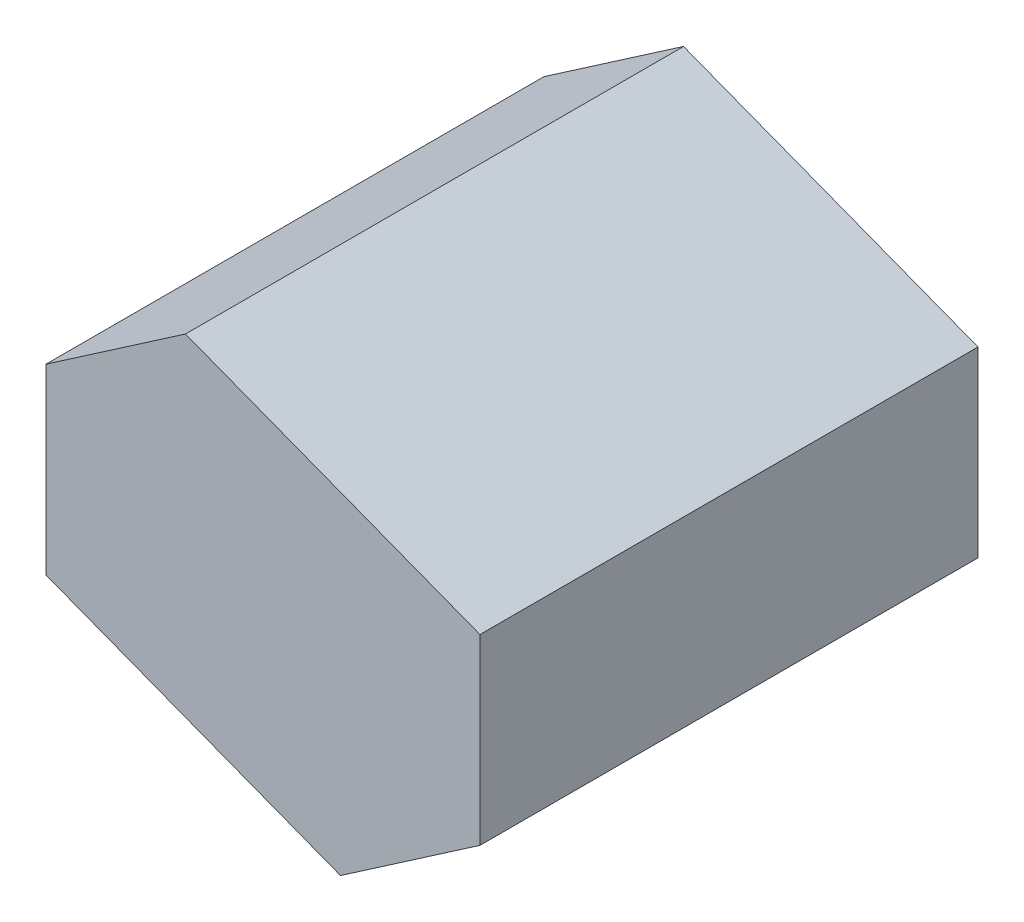
ISO-10303-21;
HEADER;
FILE_DESCRIPTION(('STEP AP214'),'2;1');
FILE_NAME('part.step','',(''),(''),'','','');
FILE_SCHEMA(('AUTOMOTIVE_DESIGN { 1 0 10303 214 1 1 1 1 }'));
ENDSEC;
DATA;
#1=APPLICATION_CONTEXT('core data for automotive mechanical design processes');
#2=APPLICATION_PROTOCOL_DEFINITION('international standard','automotive_design',2000,#1);
#3=PRODUCT_CONTEXT('',#1,'mechanical');
#4=PRODUCT('Part','Part','',(#3));
#5=PRODUCT_RELATED_PRODUCT_CATEGORY('part','',(#4));
#6=PRODUCT_DEFINITION_FORMATION('','',#4);
#7=PRODUCT_DEFINITION_CONTEXT('part definition',#1,'design');
#8=PRODUCT_DEFINITION('design','',#6,#7);
#9=PRODUCT_DEFINITION_SHAPE('','',#8);
#10=(LENGTH_UNIT() NAMED_UNIT(*) SI_UNIT(.MILLI.,.METRE.));
#11=(NAMED_UNIT(*) PLANE_ANGLE_UNIT() SI_UNIT($,.RADIAN.));
#12=(NAMED_UNIT(*) SI_UNIT($,.STERADIAN.) SOLID_ANGLE_UNIT());
#13=UNCERTAINTY_MEASURE_WITH_UNIT(LENGTH_MEASURE(1.E-05),#10,'distance_accuracy_value','');
#14=(GEOMETRIC_REPRESENTATION_CONTEXT(3) GLOBAL_UNCERTAINTY_ASSIGNED_CONTEXT((#13)) GLOBAL_UNIT_ASSIGNED_CONTEXT((#10,
#11,#12)) REPRESENTATION_CONTEXT('',''));
#15=CARTESIAN_POINT('',(0.,0.,0.));
#16=DIRECTION('',(0.,0.,1.));
#17=DIRECTION('',(1.,0.,0.));
#18=AXIS2_PLACEMENT_3D('',#15,#16,#17);
#19=CARTESIAN_POINT('',(33.1981199662404,-0.0871285716620917,38.1));
#20=DIRECTION('',(-0.358367949545305,-0.9335804264972,0.));
#21=DIRECTION('',(0.9335804264972,-0.358367949545305,0.));
#22=AXIS2_PLACEMENT_3D('',#19,#20,#21);
#23=PLANE('',#22);
#24=DIRECTION('',(-0.9335804264972,0.358367949545305,0.));
#25=VECTOR('',#24,1.);
#26=CARTESIAN_POINT('',(33.1981199662404,-0.0871285716620917,-38.1));
#27=LINE('',#26,#25);
#28=CARTESIAN_POINT('',(33.1981199662404,-0.0871285716620917,-38.1));
#29=VERTEX_POINT('',#28);
#30=CARTESIAN_POINT('',(-11.8564714165144,17.2077086733943,-38.1));
#31=VERTEX_POINT('',#30);
#32=EDGE_CURVE('E222',#29,#31,#27,.T.);
#33=ORIENTED_EDGE('',*,*,#32,.T.);
#34=DIRECTION('',(0.,0.,1.));
#35=VECTOR('',#34,1.);
#36=CARTESIAN_POINT('',(-11.8564714165144,17.2077086733943,-38.1));
#37=LINE('',#36,#35);
#38=CARTESIAN_POINT('',(-11.8564714165144,17.2077086733943,38.1));
#39=VERTEX_POINT('',#38);
#40=EDGE_CURVE('E423',#31,#39,#37,.T.);
#41=ORIENTED_EDGE('',*,*,#40,.T.);
#42=DIRECTION('',(-0.9335804264972,0.358367949545305,0.));
#43=VECTOR('',#42,1.);
#44=CARTESIAN_POINT('',(33.1981199662404,-0.0871285716620917,38.1));
#45=LINE('',#44,#43);
#46=CARTESIAN_POINT('',(33.1981199662404,-0.0871285716620917,38.1));
#47=VERTEX_POINT('',#46);
#48=EDGE_CURVE('E224',#47,#39,#45,.T.);
#49=ORIENTED_EDGE('',*,*,#48,.F.);
#50=DIRECTION('',(0.,0.,-1.));
#51=VECTOR('',#50,1.);
#52=CARTESIAN_POINT('',(33.1981199662404,-0.0871285716620917,38.1));
#53=LINE('',#52,#51);
#54=EDGE_CURVE('E239',#47,#29,#53,.T.);
#55=ORIENTED_EDGE('',*,*,#54,.T.);
#56=EDGE_LOOP('',(#33,#41,#49,#55));
#57=FACE_BOUND('',#56,.T.);
#58=ADVANCED_FACE('F51',(#57),#23,.F.);
#59=CARTESIAN_POINT('',(-33.1981199662404,25.4,38.1));
#60=DIRECTION('',(1.,0.,0.));
#61=DIRECTION('',(0.,1.,0.));
#62=AXIS2_PLACEMENT_3D('',#59,#60,#61);
#63=PLANE('',#62);
#64=DIRECTION('',(0.,-1.,0.));
#65=VECTOR('',#64,1.);
#66=CARTESIAN_POINT('',(-33.1981199662404,25.4,38.1));
#67=LINE('',#66,#65);
#68=CARTESIAN_POINT('',(-33.1981199662404,2.53999999999999,38.1));
#69=VERTEX_POINT('',#68);
#70=CARTESIAN_POINT('',(-33.1981199662404,-25.4,38.1));
#71=VERTEX_POINT('',#70);
#72=EDGE_CURVE('E232',#69,#71,#67,.T.);
#73=ORIENTED_EDGE('',*,*,#72,.F.);
#74=DIRECTION('',(0.,0.,1.));
#75=VECTOR('',#74,1.);
#76=CARTESIAN_POINT('',(-33.1981199662404,2.53999999999999,-38.1));
#77=LINE('',#76,#75);
#78=CARTESIAN_POINT('',(-33.1981199662404,2.53999999999999,-38.1));
#79=VERTEX_POINT('',#78);
#80=EDGE_CURVE('E428',#79,#69,#77,.T.);
#81=ORIENTED_EDGE('',*,*,#80,.F.);
#82=DIRECTION('',(0.,-1.,0.));
#83=VECTOR('',#82,1.);
#84=CARTESIAN_POINT('',(-33.1981199662404,25.4,-38.1));
#85=LINE('',#84,#83);
#86=CARTESIAN_POINT('',(-33.1981199662404,-25.4,-38.1));
#87=VERTEX_POINT('',#86);
#88=EDGE_CURVE('E235',#79,#87,#85,.T.);
#89=ORIENTED_EDGE('',*,*,#88,.T.);
#90=DIRECTION('',(0.,0.,-1.));
#91=VECTOR('',#90,1.);
#92=CARTESIAN_POINT('',(-33.1981199662404,-25.4,38.1));
#93=LINE('',#92,#91);
#94=EDGE_CURVE('E242',#71,#87,#93,.T.);
#95=ORIENTED_EDGE('',*,*,#94,.F.);
#96=EDGE_LOOP('',(#73,#81,#89,#95));
#97=FACE_BOUND('',#96,.T.);
#98=ADVANCED_FACE('F452',(#97),#63,.F.);
#99=CARTESIAN_POINT('',(-33.1981199662404,-25.4,38.1));
#100=DIRECTION('',(0.358367949545305,0.9335804264972,0.));
#101=DIRECTION('',(-0.9335804264972,0.358367949545305,0.));
#102=AXIS2_PLACEMENT_3D('',#99,#100,#101);
#103=PLANE('',#102);
#104=DIRECTION('',(0.9335804264972,-0.358367949545305,0.));
#105=VECTOR('',#104,1.);
#106=CARTESIAN_POINT('',(-33.1981199662404,-25.4,-38.1));
#107=LINE('',#106,#105);
#108=CARTESIAN_POINT('',(11.8564714165144,-42.6948372450564,-38.1));
#109=VERTEX_POINT('',#108);
#110=EDGE_CURVE('E225',#87,#109,#107,.T.);
#111=ORIENTED_EDGE('',*,*,#110,.T.);
#112=DIRECTION('',(0.,0.,1.));
#113=VECTOR('',#112,1.);
#114=CARTESIAN_POINT('',(11.8564714165144,-42.6948372450564,-38.1));
#115=LINE('',#114,#113);
#116=CARTESIAN_POINT('',(11.8564714165144,-42.6948372450564,38.1));
#117=VERTEX_POINT('',#116);
#118=EDGE_CURVE('E201',#109,#117,#115,.T.);
#119=ORIENTED_EDGE('',*,*,#118,.T.);
#120=DIRECTION('',(0.9335804264972,-0.358367949545305,0.));
#121=VECTOR('',#120,1.);
#122=CARTESIAN_POINT('',(-33.1981199662404,-25.4,38.1));
#123=LINE('',#122,#121);
#124=EDGE_CURVE('E438',#71,#117,#123,.T.);
#125=ORIENTED_EDGE('',*,*,#124,.F.);
#126=ORIENTED_EDGE('',*,*,#94,.T.);
#127=EDGE_LOOP('',(#111,#119,#125,#126));
#128=FACE_BOUND('',#127,.T.);
#129=ADVANCED_FACE('F455',(#128),#103,.F.);
#130=CARTESIAN_POINT('',(33.1981199662404,-50.8871285716621,38.1));
#131=DIRECTION('',(-1.,0.,0.));
#132=DIRECTION('',(0.,-1.,0.));
#133=AXIS2_PLACEMENT_3D('',#130,#131,#132);
#134=PLANE('',#133);
#135=DIRECTION('',(0.,1.,0.));
#136=VECTOR('',#135,1.);
#137=CARTESIAN_POINT('',(33.1981199662404,-50.8871285716621,38.1));
#138=LINE('',#137,#136);
#139=CARTESIAN_POINT('',(33.1981199662404,-28.0271285716621,38.1));
#140=VERTEX_POINT('',#139);
#141=EDGE_CURVE('E215',#140,#47,#138,.T.);
#142=ORIENTED_EDGE('',*,*,#141,.F.);
#143=DIRECTION('',(0.,0.,1.));
#144=VECTOR('',#143,1.);
#145=CARTESIAN_POINT('',(33.1981199662404,-28.0271285716621,-38.1));
#146=LINE('',#145,#144);
#147=CARTESIAN_POINT('',(33.1981199662404,-28.0271285716621,-38.1));
#148=VERTEX_POINT('',#147);
#149=EDGE_CURVE('E198',#148,#140,#146,.T.);
#150=ORIENTED_EDGE('',*,*,#149,.F.);
#151=DIRECTION('',(0.,1.,0.));
#152=VECTOR('',#151,1.);
#153=CARTESIAN_POINT('',(33.1981199662404,-50.8871285716621,-38.1));
#154=LINE('',#153,#152);
#155=EDGE_CURVE('E213',#148,#29,#154,.T.);
#156=ORIENTED_EDGE('',*,*,#155,.T.);
#157=ORIENTED_EDGE('',*,*,#54,.F.);
#158=EDGE_LOOP('',(#142,#150,#156,#157));
#159=FACE_BOUND('',#158,.T.);
#160=ADVANCED_FACE('F211',(#159),#134,.F.);
#161=CARTESIAN_POINT('',(0.,0.,38.1));
#162=DIRECTION('',(0.,0.,1.));
#163=DIRECTION('',(1.,0.,0.));
#164=AXIS2_PLACEMENT_3D('',#161,#162,#163);
#165=PLANE('',#164);
#166=DIRECTION('',(-0.824126188622017,-0.566406236924831,0.));
#167=VECTOR('',#166,1.);
#168=CARTESIAN_POINT('',(11.8564714165144,-42.6948372450564,38.1));
#169=LINE('',#168,#167);
#170=EDGE_CURVE('E207',#140,#117,#169,.T.);
#171=ORIENTED_EDGE('',*,*,#170,.F.);
#172=ORIENTED_EDGE('',*,*,#141,.T.);
#173=ORIENTED_EDGE('',*,*,#48,.T.);
#174=DIRECTION('',(0.824126188622017,0.566406236924831,0.));
#175=VECTOR('',#174,1.);
#176=CARTESIAN_POINT('',(-11.8564714165144,17.2077086733943,38.1));
#177=LINE('',#176,#175);
#178=EDGE_CURVE('E420',#69,#39,#177,.T.);
#179=ORIENTED_EDGE('',*,*,#178,.F.);
#180=ORIENTED_EDGE('',*,*,#72,.T.);
#181=ORIENTED_EDGE('',*,*,#124,.T.);
#182=EDGE_LOOP('',(#171,#172,#173,#179,#180,#181));
#183=FACE_BOUND('',#182,.T.);
#184=ADVANCED_FACE('F457',(#183),#165,.T.);
#185=CARTESIAN_POINT('',(0.,0.,-38.1));
#186=DIRECTION('',(0.,0.,1.));
#187=DIRECTION('',(1.,0.,0.));
#188=AXIS2_PLACEMENT_3D('',#185,#186,#187);
#189=PLANE('',#188);
#190=DIRECTION('',(-0.824126188622017,-0.566406236924831,0.));
#191=VECTOR('',#190,1.);
#192=CARTESIAN_POINT('',(23.2537214142629,-33.8343746079865,-38.1));
#193=LINE('',#192,#191);
#194=CARTESIAN_POINT('',(24.2188228587639,-33.171078762062,-38.1));
#195=VERTEX_POINT('',#194);
#196=CARTESIAN_POINT('',(19.4533207419128,-36.4463176251494,-38.1));
#197=VERTEX_POINT('',#196);
#198=EDGE_CURVE('E405',#195,#197,#193,.T.);
#199=ORIENTED_EDGE('',*,*,#198,.F.);
#200=CARTESIAN_POINT('',(14.1481199662404,-18.5181151283625,-38.1));
#201=DIRECTION('',(0.,0.,1.));
#202=DIRECTION('',(1.,0.,0.));
#203=AXIS2_PLACEMENT_3D('',#200,#201,#202);
#204=CIRCLE('',#203,17.78);
#205=CARTESIAN_POINT('',(31.9281199662404,-18.5181151283625,-38.1));
#206=VERTEX_POINT('',#205);
#207=EDGE_CURVE('E11',#195,#206,#204,.T.);
#208=ORIENTED_EDGE('',*,*,#207,.T.);
#209=DIRECTION('',(0.,1.,0.));
#210=VECTOR('',#209,1.);
#211=CARTESIAN_POINT('',(31.9281199662404,-50.8871285716621,-38.1));
#212=LINE('',#211,#210);
#213=CARTESIAN_POINT('',(31.9281199662404,-12.7263785454803,-38.1));
#214=VERTEX_POINT('',#213);
#215=EDGE_CURVE('E431',#206,#214,#212,.T.);
#216=ORIENTED_EDGE('',*,*,#215,.T.);
#217=CARTESIAN_POINT('',(14.1481199662404,-12.7263785454803,-38.1));
#218=DIRECTION('',(0.,0.,1.));
#219=DIRECTION('',(1.,0.,0.));
#220=AXIS2_PLACEMENT_3D('',#217,#218,#219);
#221=CIRCLE('',#220,17.78);
#222=CARTESIAN_POINT('',(20.5199021091559,3.8726814376399,-38.1));
#223=VERTEX_POINT('',#222);
#224=EDGE_CURVE('E317',#214,#223,#221,.T.);
#225=ORIENTED_EDGE('',*,*,#224,.T.);
#226=DIRECTION('',(-0.9335804264972,0.358367949545305,0.));
#227=VECTOR('',#226,1.);
#228=CARTESIAN_POINT('',(32.8947020723769,-0.877559208998293,-38.1));
#229=LINE('',#228,#227);
#230=CARTESIAN_POINT('',(-3.01083570647379,12.9052854029081,-38.1));
#231=VERTEX_POINT('',#230);
#232=EDGE_CURVE('E412',#223,#231,#229,.T.);
#233=ORIENTED_EDGE('',*,*,#232,.T.);
#234=CARTESIAN_POINT('',(-9.3826178493893,-3.6937745802121,-38.1));
#235=DIRECTION('',(0.,0.,1.));
#236=DIRECTION('',(1.,0.,0.));
#237=AXIS2_PLACEMENT_3D('',#234,#235,#236);
#238=CIRCLE('',#237,17.78);
#239=CARTESIAN_POINT('',(-19.4533207419128,10.9591890534874,-38.1));
#240=VERTEX_POINT('',#239);
#241=EDGE_CURVE('E320',#231,#240,#238,.T.);
#242=ORIENTED_EDGE('',*,*,#241,.T.);
#243=DIRECTION('',(0.824126188622017,0.566406236924831,0.));
#244=VECTOR('',#243,1.);
#245=CARTESIAN_POINT('',(-11.3565792332023,16.5239253191434,-38.1));
#246=LINE('',#245,#244);
#247=CARTESIAN_POINT('',(-24.6421570387639,7.3930006693607,-38.1));
#248=VERTEX_POINT('',#247);
#249=EDGE_CURVE('E400',#248,#240,#246,.T.);
#250=ORIENTED_EDGE('',*,*,#249,.F.);
#251=CARTESIAN_POINT('',(-14.5714541462404,-7.25996296433876,-38.1));
#252=DIRECTION('',(0.,0.,1.));
#253=DIRECTION('',(1.,0.,0.));
#254=AXIS2_PLACEMENT_3D('',#251,#252,#253);
#255=CIRCLE('',#254,17.78);
#256=CARTESIAN_POINT('',(-32.3514541462404,-7.25996296433877,-38.1));
#257=VERTEX_POINT('',#256);
#258=EDGE_CURVE('E323',#248,#257,#255,.T.);
#259=ORIENTED_EDGE('',*,*,#258,.T.);
#260=DIRECTION('',(0.,-1.,0.));
#261=VECTOR('',#260,1.);
#262=CARTESIAN_POINT('',(-32.3514541462404,25.4,-38.1));
#263=LINE('',#262,#261);
#264=CARTESIAN_POINT('',(-32.3514541462404,-12.5982472596786,-38.1));
#265=VERTEX_POINT('',#264);
#266=EDGE_CURVE('E415',#257,#265,#263,.T.);
#267=ORIENTED_EDGE('',*,*,#266,.T.);
#268=CARTESIAN_POINT('',(-14.5714541462404,-12.5982472596786,-38.1));
#269=DIRECTION('',(0.,0.,1.));
#270=DIRECTION('',(1.,0.,0.));
#271=AXIS2_PLACEMENT_3D('',#268,#269,#270);
#272=CIRCLE('',#271,17.78);
#273=CARTESIAN_POINT('',(-20.9432362891559,-29.1973072427988,-38.1));
#274=VERTEX_POINT('',#273);
#275=EDGE_CURVE('E61',#265,#274,#272,.T.);
#276=ORIENTED_EDGE('',*,*,#275,.T.);
#277=DIRECTION('',(0.9335804264972,-0.358367949545305,0.));
#278=VECTOR('',#277,1.);
#279=CARTESIAN_POINT('',(-32.8947020723769,-24.6095693626638,-38.1));
#280=LINE('',#279,#278);
#281=CARTESIAN_POINT('',(3.01083570647379,-38.3924139745702,-38.1));
#282=VERTEX_POINT('',#281);
#283=EDGE_CURVE('E553',#274,#282,#280,.T.);
#284=ORIENTED_EDGE('',*,*,#283,.T.);
#285=CARTESIAN_POINT('',(9.3826178493893,-21.79335399145,-38.1));
#286=DIRECTION('',(0.,0.,1.));
#287=DIRECTION('',(1.,0.,0.));
#288=AXIS2_PLACEMENT_3D('',#285,#286,#287);
#289=CIRCLE('',#288,17.78);
#290=EDGE_CURVE('E326',#282,#197,#289,.T.);
#291=ORIENTED_EDGE('',*,*,#290,.T.);
#292=EDGE_LOOP('',(#199,#208,#216,#225,#233,#242,#250,#259,#267,#276,#284,#291));
#293=FACE_BOUND('',#292,.T.);
#294=ORIENTED_EDGE('',*,*,#155,.F.);
#295=DIRECTION('',(-0.824126188622017,-0.566406236924831,0.));
#296=VECTOR('',#295,1.);
#297=CARTESIAN_POINT('',(11.8564714165144,-42.6948372450564,-38.1));
#298=LINE('',#297,#296);
#299=EDGE_CURVE('E195',#148,#109,#298,.T.);
#300=ORIENTED_EDGE('',*,*,#299,.T.);
#301=ORIENTED_EDGE('',*,*,#110,.F.);
#302=ORIENTED_EDGE('',*,*,#88,.F.);
#303=DIRECTION('',(0.824126188622017,0.566406236924831,0.));
#304=VECTOR('',#303,1.);
#305=CARTESIAN_POINT('',(-11.8564714165144,17.2077086733943,-38.1));
#306=LINE('',#305,#304);
#307=EDGE_CURVE('E427',#79,#31,#306,.T.);
#308=ORIENTED_EDGE('',*,*,#307,.T.);
#309=ORIENTED_EDGE('',*,*,#32,.F.);
#310=EDGE_LOOP('',(#294,#300,#301,#302,#308,#309));
#311=FACE_BOUND('',#310,.T.);
#312=ADVANCED_FACE('F219',(#293,#311),#189,.F.);
#313=CARTESIAN_POINT('',(-11.8564714165144,17.2077086733943,-38.1));
#314=DIRECTION('',(0.566406236924831,-0.824126188622017,0.));
#315=DIRECTION('',(0.824126188622017,0.566406236924831,0.));
#316=AXIS2_PLACEMENT_3D('',#313,#314,#315);
#317=PLANE('',#316);
#318=ORIENTED_EDGE('',*,*,#178,.T.);
#319=ORIENTED_EDGE('',*,*,#40,.F.);
#320=ORIENTED_EDGE('',*,*,#307,.F.);
#321=ORIENTED_EDGE('',*,*,#80,.T.);
#322=EDGE_LOOP('',(#318,#319,#320,#321));
#323=FACE_BOUND('',#322,.T.);
#324=ADVANCED_FACE('F461',(#323),#317,.F.);
#325=CARTESIAN_POINT('',(11.8564714165144,-42.6948372450564,-38.1));
#326=DIRECTION('',(-0.566406236924831,0.824126188622017,0.));
#327=DIRECTION('',(-0.824126188622017,-0.566406236924831,0.));
#328=AXIS2_PLACEMENT_3D('',#325,#326,#327);
#329=PLANE('',#328);
#330=ORIENTED_EDGE('',*,*,#170,.T.);
#331=ORIENTED_EDGE('',*,*,#118,.F.);
#332=ORIENTED_EDGE('',*,*,#299,.F.);
#333=ORIENTED_EDGE('',*,*,#149,.T.);
#334=EDGE_LOOP('',(#330,#331,#332,#333));
#335=FACE_BOUND('',#334,.T.);
#336=ADVANCED_FACE('F197',(#335),#329,.F.);
#337=CARTESIAN_POINT('',(32.8947020723769,-0.877559208998293,38.1));
#338=DIRECTION('',(-0.358367949545305,-0.9335804264972,0.));
#339=DIRECTION('',(0.9335804264972,-0.358367949545305,0.));
#340=AXIS2_PLACEMENT_3D('',#337,#338,#339);
#341=PLANE('',#340);
#342=ORIENTED_EDGE('',*,*,#232,.F.);
#343=DIRECTION('',(0.,0.,-1.));
#344=VECTOR('',#343,1.);
#345=CARTESIAN_POINT('',(20.5199021091559,3.8726814376399,37.25333418));
#346=LINE('',#345,#344);
#347=CARTESIAN_POINT('',(20.5199021091559,3.8726814376399,19.47333418));
#348=VERTEX_POINT('',#347);
#349=EDGE_CURVE('E281',#223,#348,#346,.F.);
#350=ORIENTED_EDGE('',*,*,#349,.T.);
#351=DIRECTION('',(-0.9335804264972,0.358367949545305,0.));
#352=VECTOR('',#351,1.);
#353=CARTESIAN_POINT('',(32.8947020723769,-0.877559208998293,19.47333418));
#354=LINE('',#353,#352);
#355=CARTESIAN_POINT('',(-3.01083570647377,12.9052854029081,19.47333418));
#356=VERTEX_POINT('',#355);
#357=EDGE_CURVE('E278',#348,#356,#354,.T.);
#358=ORIENTED_EDGE('',*,*,#357,.T.);
#359=DIRECTION('',(0.,0.,1.));
#360=VECTOR('',#359,1.);
#361=CARTESIAN_POINT('',(-3.01083570647378,12.9052854029081,-38.1));
#362=LINE('',#361,#360);
#363=EDGE_CURVE('E275',#356,#231,#362,.F.);
#364=ORIENTED_EDGE('',*,*,#363,.T.);
#365=EDGE_LOOP('',(#342,#350,#358,#364));
#366=FACE_BOUND('',#365,.T.);
#367=ADVANCED_FACE('F577',(#366),#341,.T.);
#368=CARTESIAN_POINT('',(-32.3514541462404,25.4,38.1));
#369=DIRECTION('',(1.,0.,0.));
#370=DIRECTION('',(0.,1.,0.));
#371=AXIS2_PLACEMENT_3D('',#368,#369,#370);
#372=PLANE('',#371);
#373=ORIENTED_EDGE('',*,*,#266,.F.);
#374=DIRECTION('',(0.,0.,1.));
#375=VECTOR('',#374,1.);
#376=CARTESIAN_POINT('',(-32.3514541462404,-7.25996296433877,37.25333418));
#377=LINE('',#376,#375);
#378=CARTESIAN_POINT('',(-32.3514541462404,-7.25996296433877,19.47333418));
#379=VERTEX_POINT('',#378);
#380=EDGE_CURVE('E299',#257,#379,#377,.T.);
#381=ORIENTED_EDGE('',*,*,#380,.T.);
#382=DIRECTION('',(0.,-1.,0.));
#383=VECTOR('',#382,1.);
#384=CARTESIAN_POINT('',(-32.3514541462404,25.4,19.47333418));
#385=LINE('',#384,#383);
#386=CARTESIAN_POINT('',(-32.3514541462404,-12.5982472596786,19.47333418));
#387=VERTEX_POINT('',#386);
#388=EDGE_CURVE('E296',#379,#387,#385,.T.);
#389=ORIENTED_EDGE('',*,*,#388,.T.);
#390=DIRECTION('',(0.,0.,-1.));
#391=VECTOR('',#390,1.);
#392=CARTESIAN_POINT('',(-32.3514541462404,-12.5982472596786,-38.1));
#393=LINE('',#392,#391);
#394=EDGE_CURVE('E293',#387,#265,#393,.T.);
#395=ORIENTED_EDGE('',*,*,#394,.T.);
#396=EDGE_LOOP('',(#373,#381,#389,#395));
#397=FACE_BOUND('',#396,.T.);
#398=ADVANCED_FACE('F549',(#397),#372,.T.);
#399=CARTESIAN_POINT('',(-32.8947020723769,-24.6095693626638,38.1));
#400=DIRECTION('',(0.358367949545305,0.9335804264972,0.));
#401=DIRECTION('',(-0.9335804264972,0.358367949545305,0.));
#402=AXIS2_PLACEMENT_3D('',#399,#400,#401);
#403=PLANE('',#402);
#404=DIRECTION('',(0.9335804264972,-0.358367949545305,0.));
#405=VECTOR('',#404,1.);
#406=CARTESIAN_POINT('',(-32.8947020723769,-24.6095693626638,19.47333418));
#407=LINE('',#406,#405);
#408=CARTESIAN_POINT('',(-20.9432362891559,-29.1973072427988,19.47333418));
#409=VERTEX_POINT('',#408);
#410=CARTESIAN_POINT('',(3.01083570647378,-38.3924139745702,19.47333418));
#411=VERTEX_POINT('',#410);
#412=EDGE_CURVE('E305',#409,#411,#407,.T.);
#413=ORIENTED_EDGE('',*,*,#412,.T.);
#414=DIRECTION('',(0.,0.,1.));
#415=VECTOR('',#414,1.);
#416=CARTESIAN_POINT('',(3.01083570647378,-38.3924139745702,-38.1));
#417=LINE('',#416,#415);
#418=EDGE_CURVE('E308',#411,#282,#417,.F.);
#419=ORIENTED_EDGE('',*,*,#418,.T.);
#420=ORIENTED_EDGE('',*,*,#283,.F.);
#421=DIRECTION('',(0.,0.,-1.));
#422=VECTOR('',#421,1.);
#423=CARTESIAN_POINT('',(-20.9432362891559,-29.1973072427988,37.25333418));
#424=LINE('',#423,#422);
#425=EDGE_CURVE('E302',#274,#409,#424,.F.);
#426=ORIENTED_EDGE('',*,*,#425,.T.);
#427=EDGE_LOOP('',(#413,#419,#420,#426));
#428=FACE_BOUND('',#427,.T.);
#429=ADVANCED_FACE('F595',(#428),#403,.T.);
#430=CARTESIAN_POINT('',(31.9281199662404,-50.8871285716621,38.1));
#431=DIRECTION('',(-1.,0.,0.));
#432=DIRECTION('',(0.,-1.,0.));
#433=AXIS2_PLACEMENT_3D('',#430,#431,#432);
#434=PLANE('',#433);
#435=DIRECTION('',(0.,1.,0.));
#436=VECTOR('',#435,1.);
#437=CARTESIAN_POINT('',(31.9281199662404,-50.8871285716621,19.47333418));
#438=LINE('',#437,#436);
#439=CARTESIAN_POINT('',(31.9281199662404,-18.5181151283625,19.47333418));
#440=VERTEX_POINT('',#439);
#441=CARTESIAN_POINT('',(31.9281199662404,-12.7263785454803,19.47333418));
#442=VERTEX_POINT('',#441);
#443=EDGE_CURVE('E249',#440,#442,#438,.T.);
#444=ORIENTED_EDGE('',*,*,#443,.T.);
#445=DIRECTION('',(0.,0.,-1.));
#446=VECTOR('',#445,1.);
#447=CARTESIAN_POINT('',(31.9281199662404,-12.7263785454803,-38.1));
#448=LINE('',#447,#446);
#449=EDGE_CURVE('E253',#442,#214,#448,.T.);
#450=ORIENTED_EDGE('',*,*,#449,.T.);
#451=ORIENTED_EDGE('',*,*,#215,.F.);
#452=DIRECTION('',(0.,0.,1.));
#453=VECTOR('',#452,1.);
#454=CARTESIAN_POINT('',(31.9281199662404,-18.5181151283625,37.25333418));
#455=LINE('',#454,#453);
#456=EDGE_CURVE('E246',#206,#440,#455,.T.);
#457=ORIENTED_EDGE('',*,*,#456,.T.);
#458=EDGE_LOOP('',(#444,#450,#451,#457));
#459=FACE_BOUND('',#458,.T.);
#460=ADVANCED_FACE('F656',(#459),#434,.T.);
#461=CARTESIAN_POINT('',(0.,0.,37.25333418));
#462=DIRECTION('',(0.,0.,1.));
#463=DIRECTION('',(1.,0.,0.));
#464=AXIS2_PLACEMENT_3D('',#461,#462,#463);
#465=PLANE('',#464);
#466=DIRECTION('',(-0.9335804264972,0.358367949545305,0.));
#467=VECTOR('',#466,1.);
#468=CARTESIAN_POINT('',(-2.44079578489708,-6.35849040838601,37.25333418));
#469=LINE('',#468,#467);
#470=CARTESIAN_POINT('',(-9.3826178493893,-3.6937745802121,37.25333418));
#471=VERTEX_POINT('',#470);
#472=CARTESIAN_POINT('',(14.1481199662404,-12.7263785454803,37.25333418));
#473=VERTEX_POINT('',#472);
#474=EDGE_CURVE('E268',#471,#473,#469,.F.);
#475=ORIENTED_EDGE('',*,*,#474,.T.);
#476=DIRECTION('',(0.,1.,0.));
#477=VECTOR('',#476,1.);
#478=CARTESIAN_POINT('',(14.1481199662404,0.,37.25333418));
#479=LINE('',#478,#477);
#480=CARTESIAN_POINT('',(14.1481199662404,-18.5181151283625,37.25333418));
#481=VERTEX_POINT('',#480);
#482=EDGE_CURVE('E271',#473,#481,#479,.F.);
#483=ORIENTED_EDGE('',*,*,#482,.T.);
#484=DIRECTION('',(-0.824126188622017,-0.566406236924831,0.));
#485=VECTOR('',#484,1.);
#486=CARTESIAN_POINT('',(13.1830185217394,-19.181410974287,37.25333418));
#487=LINE('',#486,#485);
#488=CARTESIAN_POINT('',(9.38261784938929,-21.79335399145,37.25333418));
#489=VERTEX_POINT('',#488);
#490=EDGE_CURVE('E256',#481,#489,#487,.T.);
#491=ORIENTED_EDGE('',*,*,#490,.T.);
#492=DIRECTION('',(0.9335804264972,-0.358367949545305,0.));
#493=VECTOR('',#492,1.);
#494=CARTESIAN_POINT('',(-6.08631311285423,-15.8553877345988,37.25333418));
#495=LINE('',#494,#493);
#496=CARTESIAN_POINT('',(-14.5714541462404,-12.5982472596786,37.25333418));
#497=VERTEX_POINT('',#496);
#498=EDGE_CURVE('E259',#489,#497,#495,.F.);
#499=ORIENTED_EDGE('',*,*,#498,.T.);
#500=DIRECTION('',(0.,-1.,0.));
#501=VECTOR('',#500,1.);
#502=CARTESIAN_POINT('',(-14.5714541462404,0.,37.25333418));
#503=LINE('',#502,#501);
#504=CARTESIAN_POINT('',(-14.5714541462404,-7.25996296433877,37.25333418));
#505=VERTEX_POINT('',#504);
#506=EDGE_CURVE('E262',#497,#505,#503,.F.);
#507=ORIENTED_EDGE('',*,*,#506,.T.);
#508=DIRECTION('',(0.824126188622017,0.566406236924831,0.));
#509=VECTOR('',#508,1.);
#510=CARTESIAN_POINT('',(-1.28587634067877,1.87096168544391,37.25333418));
#511=LINE('',#510,#509);
#512=EDGE_CURVE('E265',#505,#471,#511,.T.);
#513=ORIENTED_EDGE('',*,*,#512,.T.);
#514=EDGE_LOOP('',(#475,#483,#491,#499,#507,#513));
#515=FACE_BOUND('',#514,.T.);
#516=ADVANCED_FACE('F610',(#515),#465,.F.);
#517=CARTESIAN_POINT('',(-11.3769146154754,16.5099491981212,-38.1));
#518=DIRECTION('',(0.566406236924831,-0.824126188622017,0.));
#519=DIRECTION('',(0.824126188622017,0.566406236924831,0.));
#520=AXIS2_PLACEMENT_3D('',#517,#518,#519);
#521=PLANE('',#520);
#522=ORIENTED_EDGE('',*,*,#249,.T.);
#523=DIRECTION('',(0.,0.,1.));
#524=VECTOR('',#523,1.);
#525=CARTESIAN_POINT('',(-19.4533207419128,10.9591890534874,37.25333418));
#526=LINE('',#525,#524);
#527=CARTESIAN_POINT('',(-19.4533207419128,10.9591890534874,19.47333418));
#528=VERTEX_POINT('',#527);
#529=EDGE_CURVE('E290',#240,#528,#526,.T.);
#530=ORIENTED_EDGE('',*,*,#529,.T.);
#531=DIRECTION('',(0.824126188622017,0.566406236924831,0.));
#532=VECTOR('',#531,1.);
#533=CARTESIAN_POINT('',(-11.3769146154754,16.5099491981212,19.47333418));
#534=LINE('',#533,#532);
#535=CARTESIAN_POINT('',(-24.6421570387639,7.3930006693607,19.47333418));
#536=VERTEX_POINT('',#535);
#537=EDGE_CURVE('E287',#528,#536,#534,.F.);
#538=ORIENTED_EDGE('',*,*,#537,.T.);
#539=DIRECTION('',(0.,0.,1.));
#540=VECTOR('',#539,1.);
#541=CARTESIAN_POINT('',(-24.6421570387639,7.3930006693607,-38.1));
#542=LINE('',#541,#540);
#543=EDGE_CURVE('E284',#536,#248,#542,.F.);
#544=ORIENTED_EDGE('',*,*,#543,.T.);
#545=EDGE_LOOP('',(#522,#530,#538,#544));
#546=FACE_BOUND('',#545,.T.);
#547=ADVANCED_FACE('F586',(#546),#521,.T.);
#548=CARTESIAN_POINT('',(11.3769146154754,-41.9970777697833,-38.1));
#549=DIRECTION('',(-0.566406236924831,0.824126188622017,0.));
#550=DIRECTION('',(-0.824126188622017,-0.566406236924831,0.));
#551=AXIS2_PLACEMENT_3D('',#548,#549,#550);
#552=PLANE('',#551);
#553=ORIENTED_EDGE('',*,*,#198,.T.);
#554=DIRECTION('',(0.,0.,1.));
#555=VECTOR('',#554,1.);
#556=CARTESIAN_POINT('',(19.4533207419128,-36.4463176251494,37.25333418));
#557=LINE('',#556,#555);
#558=CARTESIAN_POINT('',(19.4533207419128,-36.4463176251494,19.47333418));
#559=VERTEX_POINT('',#558);
#560=EDGE_CURVE('E69',#197,#559,#557,.T.);
#561=ORIENTED_EDGE('',*,*,#560,.T.);
#562=DIRECTION('',(-0.824126188622017,-0.566406236924831,0.));
#563=VECTOR('',#562,1.);
#564=CARTESIAN_POINT('',(11.3769146154754,-41.9970777697833,19.47333418));
#565=LINE('',#564,#563);
#566=CARTESIAN_POINT('',(24.2188228587639,-33.171078762062,19.47333418));
#567=VERTEX_POINT('',#566);
#568=EDGE_CURVE('E74',#559,#567,#565,.F.);
#569=ORIENTED_EDGE('',*,*,#568,.T.);
#570=DIRECTION('',(0.,0.,1.));
#571=VECTOR('',#570,1.);
#572=CARTESIAN_POINT('',(24.2188228587639,-33.171078762062,-38.1));
#573=LINE('',#572,#571);
#574=EDGE_CURVE('E311',#567,#195,#573,.F.);
#575=ORIENTED_EDGE('',*,*,#574,.T.);
#576=EDGE_LOOP('',(#553,#561,#569,#575));
#577=FACE_BOUND('',#576,.T.);
#578=ADVANCED_FACE('F537',(#577),#552,.T.);
#579=CARTESIAN_POINT('',(-14.5714541462404,-12.5982472596786,38.1));
#580=DIRECTION('',(0.,0.,1.));
#581=DIRECTION('',(1.,0.,0.));
#582=AXIS2_PLACEMENT_3D('',#579,#580,#581);
#583=CYLINDRICAL_SURFACE('',#582,17.78);
#584=ORIENTED_EDGE('',*,*,#275,.F.);
#585=ORIENTED_EDGE('',*,*,#394,.F.);
#586=CARTESIAN_POINT('',(-14.5714541462404,-12.5982472596786,19.47333418));
#587=DIRECTION('',(0.,0.,-1.));
#588=DIRECTION('',(-1.,0.,0.));
#589=AXIS2_PLACEMENT_3D('',#586,#587,#588);
#590=CIRCLE('',#589,17.78);
#591=EDGE_CURVE('E391',#409,#387,#590,.T.);
#592=ORIENTED_EDGE('',*,*,#591,.F.);
#593=ORIENTED_EDGE('',*,*,#425,.F.);
#594=EDGE_LOOP('',(#584,#585,#592,#593));
#595=FACE_BOUND('',#594,.T.);
#596=ADVANCED_FACE('F53',(#595),#583,.F.);
#597=CARTESIAN_POINT('',(-14.5714541462404,-7.25996296433876,38.1));
#598=DIRECTION('',(0.,0.,-1.));
#599=DIRECTION('',(-1.,0.,0.));
#600=AXIS2_PLACEMENT_3D('',#597,#598,#599);
#601=CYLINDRICAL_SURFACE('',#600,17.78);
#602=ORIENTED_EDGE('',*,*,#258,.F.);
#603=ORIENTED_EDGE('',*,*,#543,.F.);
#604=CARTESIAN_POINT('',(-14.5714541462404,-7.25996296433876,19.47333418));
#605=DIRECTION('',(0.,0.,-1.));
#606=DIRECTION('',(-1.,0.,0.));
#607=AXIS2_PLACEMENT_3D('',#604,#605,#606);
#608=CIRCLE('',#607,17.78);
#609=EDGE_CURVE('E388',#379,#536,#608,.T.);
#610=ORIENTED_EDGE('',*,*,#609,.F.);
#611=ORIENTED_EDGE('',*,*,#380,.F.);
#612=EDGE_LOOP('',(#602,#603,#610,#611));
#613=FACE_BOUND('',#612,.T.);
#614=ADVANCED_FACE('F531',(#613),#601,.F.);
#615=CARTESIAN_POINT('',(-14.5714541462404,25.4,19.47333418));
#616=DIRECTION('',(0.,-1.,0.));
#617=DIRECTION('',(1.,0.,0.));
#618=AXIS2_PLACEMENT_3D('',#615,#616,#617);
#619=CYLINDRICAL_SURFACE('',#618,17.78);
#620=CARTESIAN_POINT('',(-14.5714541462404,-12.5982472596786,19.47333418));
#621=DIRECTION('',(0.,1.,0.));
#622=DIRECTION('',(0.,0.,1.));
#623=AXIS2_PLACEMENT_3D('',#620,#621,#622);
#624=CIRCLE('',#623,17.78);
#625=EDGE_CURVE('E55',#387,#497,#624,.T.);
#626=ORIENTED_EDGE('',*,*,#625,.F.);
#627=ORIENTED_EDGE('',*,*,#388,.F.);
#628=CARTESIAN_POINT('',(-14.5714541462404,-7.25996296433877,19.47333418));
#629=DIRECTION('',(0.,-1.,0.));
#630=DIRECTION('',(1.,0.,0.));
#631=AXIS2_PLACEMENT_3D('',#628,#629,#630);
#632=CIRCLE('',#631,17.78);
#633=EDGE_CURVE('E384',#505,#379,#632,.T.);
#634=ORIENTED_EDGE('',*,*,#633,.F.);
#635=ORIENTED_EDGE('',*,*,#506,.F.);
#636=EDGE_LOOP('',(#626,#627,#634,#635));
#637=FACE_BOUND('',#636,.T.);
#638=ADVANCED_FACE('F529',(#637),#619,.F.);
#639=CARTESIAN_POINT('',(-14.5714541462404,-12.5982472596786,19.47333418));
#640=DIRECTION('',(0.,0.,1.));
#641=DIRECTION('',(0.,-1.,0.));
#642=AXIS2_PLACEMENT_3D('',#639,#640,#641);
#643=SPHERICAL_SURFACE('',#642,17.78);
#644=ORIENTED_EDGE('',*,*,#591,.T.);
#645=ORIENTED_EDGE('',*,*,#625,.T.);
#646=CARTESIAN_POINT('',(-14.5714541462404,-12.5982472596786,19.47333418));
#647=DIRECTION('',(0.9335804264972,-0.358367949545305,0.));
#648=DIRECTION('',(0.358367949545305,0.9335804264972,0.));
#649=AXIS2_PLACEMENT_3D('',#646,#647,#648);
#650=CIRCLE('',#649,17.78);
#651=EDGE_CURVE('E381',#409,#497,#650,.F.);
#652=ORIENTED_EDGE('',*,*,#651,.F.);
#653=EDGE_LOOP('',(#644,#645,#652));
#654=FACE_BOUND('',#653,.T.);
#655=ADVANCED_FACE('F525',(#654),#643,.F.);
#656=CARTESIAN_POINT('',(-14.5714541462404,-7.25996296433877,19.47333418));
#657=DIRECTION('',(0.,0.,1.));
#658=DIRECTION('',(1.,0.,0.));
#659=AXIS2_PLACEMENT_3D('',#656,#657,#658);
#660=SPHERICAL_SURFACE('',#659,17.78);
#661=ORIENTED_EDGE('',*,*,#633,.T.);
#662=ORIENTED_EDGE('',*,*,#609,.T.);
#663=CARTESIAN_POINT('',(-14.5714541462404,-7.25996296433877,19.47333418));
#664=DIRECTION('',(0.824126188622017,0.566406236924831,0.));
#665=DIRECTION('',(-0.566406236924831,0.824126188622017,0.));
#666=AXIS2_PLACEMENT_3D('',#663,#664,#665);
#667=CIRCLE('',#666,17.78);
#668=EDGE_CURVE('E377',#505,#536,#667,.F.);
#669=ORIENTED_EDGE('',*,*,#668,.F.);
#670=EDGE_LOOP('',(#661,#662,#669));
#671=FACE_BOUND('',#670,.T.);
#672=ADVANCED_FACE('F521',(#671),#660,.F.);
#673=CARTESIAN_POINT('',(-26.5229199294614,-8.01050937954358,19.47333418));
#674=DIRECTION('',(0.9335804264972,-0.358367949545305,0.));
#675=DIRECTION('',(0.358367949545305,0.9335804264972,0.));
#676=AXIS2_PLACEMENT_3D('',#673,#674,#675);
#677=CYLINDRICAL_SURFACE('',#676,17.78);
#678=ORIENTED_EDGE('',*,*,#651,.T.);
#679=ORIENTED_EDGE('',*,*,#498,.F.);
#680=CARTESIAN_POINT('',(9.3826178493893,-21.79335399145,19.47333418));
#681=DIRECTION('',(-0.9335804264972,0.358367949545305,0.));
#682=DIRECTION('',(-0.358367949545305,-0.9335804264972,0.));
#683=AXIS2_PLACEMENT_3D('',#680,#681,#682);
#684=CIRCLE('',#683,17.78);
#685=EDGE_CURVE('E373',#411,#489,#684,.T.);
#686=ORIENTED_EDGE('',*,*,#685,.F.);
#687=ORIENTED_EDGE('',*,*,#412,.F.);
#688=EDGE_LOOP('',(#678,#679,#686,#687));
#689=FACE_BOUND('',#688,.T.);
#690=ADVANCED_FACE('F517',(#689),#677,.F.);
#691=CARTESIAN_POINT('',(9.3826178493893,-21.79335399145,-38.1));
#692=DIRECTION('',(0.,0.,-1.));
#693=DIRECTION('',(-1.,0.,0.));
#694=AXIS2_PLACEMENT_3D('',#691,#692,#693);
#695=CYLINDRICAL_SURFACE('',#694,17.78);
#696=ORIENTED_EDGE('',*,*,#290,.F.);
#697=ORIENTED_EDGE('',*,*,#418,.F.);
#698=CARTESIAN_POINT('',(9.3826178493893,-21.79335399145,19.47333418));
#699=DIRECTION('',(0.,0.,-1.));
#700=DIRECTION('',(-1.,0.,0.));
#701=AXIS2_PLACEMENT_3D('',#698,#699,#700);
#702=CIRCLE('',#701,17.78);
#703=EDGE_CURVE('E369',#559,#411,#702,.T.);
#704=ORIENTED_EDGE('',*,*,#703,.F.);
#705=ORIENTED_EDGE('',*,*,#560,.F.);
#706=EDGE_LOOP('',(#696,#697,#704,#705));
#707=FACE_BOUND('',#706,.T.);
#708=ADVANCED_FACE('F513',(#707),#695,.F.);
#709=CARTESIAN_POINT('',(-9.3826178493893,-3.6937745802121,-38.1));
#710=DIRECTION('',(0.,0.,-1.));
#711=DIRECTION('',(-1.,0.,0.));
#712=AXIS2_PLACEMENT_3D('',#709,#710,#711);
#713=CYLINDRICAL_SURFACE('',#712,17.78);
#714=ORIENTED_EDGE('',*,*,#241,.F.);
#715=ORIENTED_EDGE('',*,*,#363,.F.);
#716=CARTESIAN_POINT('',(-9.3826178493893,-3.6937745802121,19.47333418));
#717=DIRECTION('',(0.,0.,-1.));
#718=DIRECTION('',(-1.,0.,0.));
#719=AXIS2_PLACEMENT_3D('',#716,#717,#718);
#720=CIRCLE('',#719,17.78);
#721=EDGE_CURVE('E365',#528,#356,#720,.T.);
#722=ORIENTED_EDGE('',*,*,#721,.F.);
#723=ORIENTED_EDGE('',*,*,#529,.F.);
#724=EDGE_LOOP('',(#714,#715,#722,#723));
#725=FACE_BOUND('',#724,.T.);
#726=ADVANCED_FACE('F509',(#725),#713,.F.);
#727=CARTESIAN_POINT('',(-1.28587634067877,1.87096168544391,19.47333418));
#728=DIRECTION('',(0.824126188622017,0.566406236924831,0.));
#729=DIRECTION('',(-0.566406236924831,0.824126188622017,0.));
#730=AXIS2_PLACEMENT_3D('',#727,#728,#729);
#731=CYLINDRICAL_SURFACE('',#730,17.78);
#732=ORIENTED_EDGE('',*,*,#668,.T.);
#733=ORIENTED_EDGE('',*,*,#537,.F.);
#734=CARTESIAN_POINT('',(-9.3826178493893,-3.6937745802121,19.47333418));
#735=DIRECTION('',(-0.824126188622017,-0.566406236924831,0.));
#736=DIRECTION('',(0.566406236924831,-0.824126188622017,0.));
#737=AXIS2_PLACEMENT_3D('',#734,#735,#736);
#738=CIRCLE('',#737,17.78);
#739=EDGE_CURVE('E361',#471,#528,#738,.T.);
#740=ORIENTED_EDGE('',*,*,#739,.F.);
#741=ORIENTED_EDGE('',*,*,#512,.F.);
#742=EDGE_LOOP('',(#732,#733,#740,#741));
#743=FACE_BOUND('',#742,.T.);
#744=ADVANCED_FACE('F505',(#743),#731,.F.);
#745=CARTESIAN_POINT('',(9.38261784938929,-21.79335399145,19.47333418));
#746=DIRECTION('',(0.,0.,1.));
#747=DIRECTION('',(1.,0.,0.));
#748=AXIS2_PLACEMENT_3D('',#745,#746,#747);
#749=SPHERICAL_SURFACE('',#748,17.78);
#750=ORIENTED_EDGE('',*,*,#703,.T.);
#751=ORIENTED_EDGE('',*,*,#685,.T.);
#752=CARTESIAN_POINT('',(9.38261784938929,-21.79335399145,19.47333418));
#753=DIRECTION('',(0.824126188622017,0.566406236924831,0.));
#754=DIRECTION('',(-0.566406236924831,0.824126188622017,0.));
#755=AXIS2_PLACEMENT_3D('',#752,#753,#754);
#756=CIRCLE('',#755,17.78);
#757=EDGE_CURVE('E357',#559,#489,#756,.F.);
#758=ORIENTED_EDGE('',*,*,#757,.F.);
#759=EDGE_LOOP('',(#750,#751,#758));
#760=FACE_BOUND('',#759,.T.);
#761=ADVANCED_FACE('F501',(#760),#749,.F.);
#762=CARTESIAN_POINT('',(-9.3826178493893,-3.6937745802121,19.47333418));
#763=DIRECTION('',(0.,0.,1.));
#764=DIRECTION('',(0.,-1.,0.));
#765=AXIS2_PLACEMENT_3D('',#762,#763,#764);
#766=SPHERICAL_SURFACE('',#765,17.78);
#767=ORIENTED_EDGE('',*,*,#739,.T.);
#768=ORIENTED_EDGE('',*,*,#721,.T.);
#769=CARTESIAN_POINT('',(-9.3826178493893,-3.69377458021211,19.47333418));
#770=DIRECTION('',(0.9335804264972,-0.358367949545305,0.));
#771=DIRECTION('',(0.358367949545305,0.9335804264972,0.));
#772=AXIS2_PLACEMENT_3D('',#769,#770,#771);
#773=CIRCLE('',#772,17.78);
#774=EDGE_CURVE('E353',#471,#356,#773,.F.);
#775=ORIENTED_EDGE('',*,*,#774,.F.);
#776=EDGE_LOOP('',(#767,#768,#775));
#777=FACE_BOUND('',#776,.T.);
#778=ADVANCED_FACE('F497',(#777),#766,.F.);
#779=CARTESIAN_POINT('',(13.1830185217394,-19.181410974287,19.47333418));
#780=DIRECTION('',(-0.824126188622017,-0.566406236924831,0.));
#781=DIRECTION('',(0.566406236924831,-0.824126188622017,0.));
#782=AXIS2_PLACEMENT_3D('',#779,#780,#781);
#783=CYLINDRICAL_SURFACE('',#782,17.78);
#784=ORIENTED_EDGE('',*,*,#757,.T.);
#785=ORIENTED_EDGE('',*,*,#490,.F.);
#786=CARTESIAN_POINT('',(14.1481199662404,-18.5181151283625,19.47333418));
#787=DIRECTION('',(-0.824126188622017,-0.566406236924831,0.));
#788=DIRECTION('',(0.566406236924831,-0.824126188622017,0.));
#789=AXIS2_PLACEMENT_3D('',#786,#787,#788);
#790=CIRCLE('',#789,17.78);
#791=EDGE_CURVE('E349',#567,#481,#790,.T.);
#792=ORIENTED_EDGE('',*,*,#791,.F.);
#793=ORIENTED_EDGE('',*,*,#568,.F.);
#794=EDGE_LOOP('',(#784,#785,#792,#793));
#795=FACE_BOUND('',#794,.T.);
#796=ADVANCED_FACE('F493',(#795),#783,.F.);
#797=CARTESIAN_POINT('',(14.1481199662404,-18.5181151283625,38.1));
#798=DIRECTION('',(0.,0.,-1.));
#799=DIRECTION('',(-1.,0.,0.));
#800=AXIS2_PLACEMENT_3D('',#797,#798,#799);
#801=CYLINDRICAL_SURFACE('',#800,17.78);
#802=ORIENTED_EDGE('',*,*,#207,.F.);
#803=ORIENTED_EDGE('',*,*,#574,.F.);
#804=CARTESIAN_POINT('',(14.1481199662404,-18.5181151283625,19.47333418));
#805=DIRECTION('',(0.,0.,-1.));
#806=DIRECTION('',(-1.,0.,0.));
#807=AXIS2_PLACEMENT_3D('',#804,#805,#806);
#808=CIRCLE('',#807,17.78);
#809=EDGE_CURVE('E345',#440,#567,#808,.T.);
#810=ORIENTED_EDGE('',*,*,#809,.F.);
#811=ORIENTED_EDGE('',*,*,#456,.F.);
#812=EDGE_LOOP('',(#802,#803,#810,#811));
#813=FACE_BOUND('',#812,.T.);
#814=ADVANCED_FACE('F489',(#813),#801,.F.);
#815=CARTESIAN_POINT('',(14.1481199662404,-12.7263785454803,38.1));
#816=DIRECTION('',(0.,0.,1.));
#817=DIRECTION('',(1.,0.,0.));
#818=AXIS2_PLACEMENT_3D('',#815,#816,#817);
#819=CYLINDRICAL_SURFACE('',#818,17.78);
#820=ORIENTED_EDGE('',*,*,#224,.F.);
#821=ORIENTED_EDGE('',*,*,#449,.F.);
#822=CARTESIAN_POINT('',(14.1481199662404,-12.7263785454803,19.47333418));
#823=DIRECTION('',(0.,0.,-1.));
#824=DIRECTION('',(-1.,0.,0.));
#825=AXIS2_PLACEMENT_3D('',#822,#823,#824);
#826=CIRCLE('',#825,17.78);
#827=EDGE_CURVE('E341',#348,#442,#826,.T.);
#828=ORIENTED_EDGE('',*,*,#827,.F.);
#829=ORIENTED_EDGE('',*,*,#349,.F.);
#830=EDGE_LOOP('',(#820,#821,#828,#829));
#831=FACE_BOUND('',#830,.T.);
#832=ADVANCED_FACE('F485',(#831),#819,.F.);
#833=CARTESIAN_POINT('',(26.5229199294614,-17.4766191921185,19.47333418));
#834=DIRECTION('',(-0.9335804264972,0.358367949545305,0.));
#835=DIRECTION('',(-0.358367949545305,-0.9335804264972,0.));
#836=AXIS2_PLACEMENT_3D('',#833,#834,#835);
#837=CYLINDRICAL_SURFACE('',#836,17.78);
#838=ORIENTED_EDGE('',*,*,#774,.T.);
#839=ORIENTED_EDGE('',*,*,#357,.F.);
#840=CARTESIAN_POINT('',(14.1481199662404,-12.7263785454803,19.47333418));
#841=DIRECTION('',(-0.9335804264972,0.358367949545305,0.));
#842=DIRECTION('',(-0.358367949545305,-0.9335804264972,0.));
#843=AXIS2_PLACEMENT_3D('',#840,#841,#842);
#844=CIRCLE('',#843,17.78);
#845=EDGE_CURVE('E337',#473,#348,#844,.T.);
#846=ORIENTED_EDGE('',*,*,#845,.F.);
#847=ORIENTED_EDGE('',*,*,#474,.F.);
#848=EDGE_LOOP('',(#838,#839,#846,#847));
#849=FACE_BOUND('',#848,.T.);
#850=ADVANCED_FACE('F481',(#849),#837,.F.);
#851=CARTESIAN_POINT('',(14.1481199662404,-18.5181151283625,19.47333418));
#852=DIRECTION('',(0.,0.,1.));
#853=DIRECTION('',(0.,-1.,0.));
#854=AXIS2_PLACEMENT_3D('',#851,#852,#853);
#855=SPHERICAL_SURFACE('',#854,17.78);
#856=ORIENTED_EDGE('',*,*,#809,.T.);
#857=ORIENTED_EDGE('',*,*,#791,.T.);
#858=CARTESIAN_POINT('',(14.1481199662404,-18.5181151283625,19.47333418));
#859=DIRECTION('',(0.,1.,0.));
#860=DIRECTION('',(0.,0.,1.));
#861=AXIS2_PLACEMENT_3D('',#858,#859,#860);
#862=CIRCLE('',#861,17.78);
#863=EDGE_CURVE('E334',#440,#481,#862,.F.);
#864=ORIENTED_EDGE('',*,*,#863,.F.);
#865=EDGE_LOOP('',(#856,#857,#864));
#866=FACE_BOUND('',#865,.T.);
#867=ADVANCED_FACE('F477',(#866),#855,.F.);
#868=CARTESIAN_POINT('',(14.1481199662404,-12.7263785454803,19.47333418));
#869=DIRECTION('',(0.,0.,1.));
#870=DIRECTION('',(1.,0.,0.));
#871=AXIS2_PLACEMENT_3D('',#868,#869,#870);
#872=SPHERICAL_SURFACE('',#871,17.78);
#873=ORIENTED_EDGE('',*,*,#845,.T.);
#874=ORIENTED_EDGE('',*,*,#827,.T.);
#875=CARTESIAN_POINT('',(14.1481199662404,-12.7263785454803,19.47333418));
#876=DIRECTION('',(0.,-1.,0.));
#877=DIRECTION('',(0.,0.,-1.));
#878=AXIS2_PLACEMENT_3D('',#875,#876,#877);
#879=CIRCLE('',#878,17.78);
#880=EDGE_CURVE('E331',#473,#442,#879,.F.);
#881=ORIENTED_EDGE('',*,*,#880,.F.);
#882=EDGE_LOOP('',(#873,#874,#881));
#883=FACE_BOUND('',#882,.T.);
#884=ADVANCED_FACE('F473',(#883),#872,.F.);
#885=CARTESIAN_POINT('',(14.1481199662404,-50.8871285716621,19.47333418));
#886=DIRECTION('',(0.,1.,0.));
#887=DIRECTION('',(-1.,0.,0.));
#888=AXIS2_PLACEMENT_3D('',#885,#886,#887);
#889=CYLINDRICAL_SURFACE('',#888,17.78);
#890=ORIENTED_EDGE('',*,*,#863,.T.);
#891=ORIENTED_EDGE('',*,*,#482,.F.);
#892=ORIENTED_EDGE('',*,*,#880,.T.);
#893=ORIENTED_EDGE('',*,*,#443,.F.);
#894=EDGE_LOOP('',(#890,#891,#892,#893));
#895=FACE_BOUND('',#894,.T.);
#896=ADVANCED_FACE('F470',(#895),#889,.F.);
#897=CLOSED_SHELL('',(#58,#98,#129,#160,#184,#312,#324,#336,#367,#398,#429,#460,#516,#547,#578,
#596,#614,#638,#655,#672,#690,#708,#726,#744,#761,#778,#796,#814,#832,#850,#867,#884,#896));
#898=MANIFOLD_SOLID_BREP('B2',#897);
#899=ADVANCED_BREP_SHAPE_REPRESENTATION('',(#18,#898),#14);
#900=SHAPE_DEFINITION_REPRESENTATION(#9,#899);
ENDSEC;
END-ISO-10303-21;
